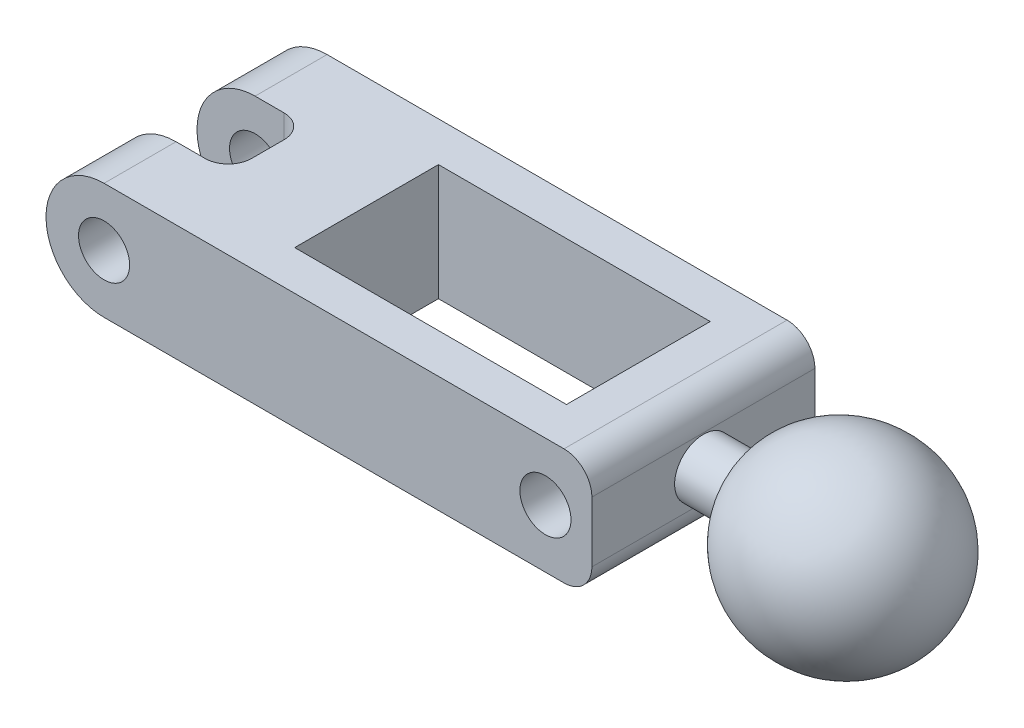
ISO-10303-21;
HEADER;
FILE_DESCRIPTION(('STEP AP214'),'2;1');
FILE_NAME('part.step','',(''),(''),'','','');
FILE_SCHEMA(('AUTOMOTIVE_DESIGN { 1 0 10303 214 1 1 1 1 }'));
ENDSEC;
DATA;
#1=APPLICATION_CONTEXT('core data for automotive mechanical design processes');
#2=APPLICATION_PROTOCOL_DEFINITION('international standard','automotive_design',2000,#1);
#3=PRODUCT_CONTEXT('',#1,'mechanical');
#4=PRODUCT('Part','Part','',(#3));
#5=PRODUCT_RELATED_PRODUCT_CATEGORY('part','',(#4));
#6=PRODUCT_DEFINITION_FORMATION('','',#4);
#7=PRODUCT_DEFINITION_CONTEXT('part definition',#1,'design');
#8=PRODUCT_DEFINITION('design','',#6,#7);
#9=PRODUCT_DEFINITION_SHAPE('','',#8);
#10=(LENGTH_UNIT() NAMED_UNIT(*) SI_UNIT(.MILLI.,.METRE.));
#11=(NAMED_UNIT(*) PLANE_ANGLE_UNIT() SI_UNIT($,.RADIAN.));
#12=(NAMED_UNIT(*) SI_UNIT($,.STERADIAN.) SOLID_ANGLE_UNIT());
#13=UNCERTAINTY_MEASURE_WITH_UNIT(LENGTH_MEASURE(1.E-05),#10,'distance_accuracy_value','');
#14=(GEOMETRIC_REPRESENTATION_CONTEXT(3) GLOBAL_UNCERTAINTY_ASSIGNED_CONTEXT((#13)) GLOBAL_UNIT_ASSIGNED_CONTEXT((#10,
#11,#12)) REPRESENTATION_CONTEXT('',''));
#15=CARTESIAN_POINT('',(0.,0.,0.));
#16=DIRECTION('',(0.,0.,1.));
#17=DIRECTION('',(1.,0.,0.));
#18=AXIS2_PLACEMENT_3D('',#15,#16,#17);
#19=CARTESIAN_POINT('',(0.,2.5,4.8));
#20=DIRECTION('',(0.,1.,0.));
#21=DIRECTION('',(-1.,0.,0.));
#22=AXIS2_PLACEMENT_3D('',#19,#20,#21);
#23=PLANE('',#22);
#24=DIRECTION('',(-1.,0.,0.));
#25=VECTOR('',#24,1.);
#26=CARTESIAN_POINT('',(0.,2.5,-3.094));
#27=LINE('',#26,#25);
#28=CARTESIAN_POINT('',(8.7,2.5,-3.094));
#29=VERTEX_POINT('',#28);
#30=CARTESIAN_POINT('',(-3.,2.5,-3.094));
#31=VERTEX_POINT('',#30);
#32=EDGE_CURVE('E240',#29,#31,#27,.T.);
#33=ORIENTED_EDGE('',*,*,#32,.F.);
#34=DIRECTION('',(0.,0.,1.));
#35=VECTOR('',#34,1.);
#36=CARTESIAN_POINT('',(8.7,2.5,4.8));
#37=LINE('',#36,#35);
#38=CARTESIAN_POINT('',(8.7,2.5,3.094));
#39=VERTEX_POINT('',#38);
#40=EDGE_CURVE('E233',#29,#39,#37,.T.);
#41=ORIENTED_EDGE('',*,*,#40,.T.);
#42=DIRECTION('',(-1.,0.,0.));
#43=VECTOR('',#42,1.);
#44=CARTESIAN_POINT('',(0.,2.5,3.094));
#45=LINE('',#44,#43);
#46=CARTESIAN_POINT('',(-3.,2.5,3.094));
#47=VERTEX_POINT('',#46);
#48=EDGE_CURVE('E225',#39,#47,#45,.T.);
#49=ORIENTED_EDGE('',*,*,#48,.T.);
#50=DIRECTION('',(0.,0.,1.));
#51=VECTOR('',#50,1.);
#52=CARTESIAN_POINT('',(-3.,2.5,4.8));
#53=LINE('',#52,#51);
#54=EDGE_CURVE('E247',#31,#47,#53,.T.);
#55=ORIENTED_EDGE('',*,*,#54,.F.);
#56=EDGE_LOOP('',(#33,#41,#49,#55));
#57=FACE_BOUND('',#56,.T.);
#58=DIRECTION('',(0.,0.,-1.));
#59=VECTOR('',#58,1.);
#60=CARTESIAN_POINT('',(-9.5,2.5,4.8));
#61=LINE('',#60,#59);
#62=CARTESIAN_POINT('',(-9.5,2.5,-1.7));
#63=VERTEX_POINT('',#62);
#64=CARTESIAN_POINT('',(-9.5,2.5,-4.8));
#65=VERTEX_POINT('',#64);
#66=EDGE_CURVE('E327',#63,#65,#61,.T.);
#67=ORIENTED_EDGE('',*,*,#66,.F.);
#68=DIRECTION('',(1.,0.,0.));
#69=VECTOR('',#68,1.);
#70=CARTESIAN_POINT('',(0.,2.5,-1.7));
#71=LINE('',#70,#69);
#72=CARTESIAN_POINT('',(-8.25,2.49999999999999,-1.7));
#73=VERTEX_POINT('',#72);
#74=EDGE_CURVE('E217',#63,#73,#71,.T.);
#75=ORIENTED_EDGE('',*,*,#74,.T.);
#76=CARTESIAN_POINT('',(-8.25,2.49999999999999,-0.7));
#77=DIRECTION('',(0.,1.,0.));
#78=DIRECTION('',(-1.,0.,0.));
#79=AXIS2_PLACEMENT_3D('',#76,#77,#78);
#80=CIRCLE('',#79,1.);
#81=CARTESIAN_POINT('',(-7.25,2.49999999999999,-0.7));
#82=VERTEX_POINT('',#81);
#83=EDGE_CURVE('E380',#73,#82,#80,.F.);
#84=ORIENTED_EDGE('',*,*,#83,.T.);
#85=DIRECTION('',(0.,0.,1.));
#86=VECTOR('',#85,1.);
#87=CARTESIAN_POINT('',(-7.25,2.49999999999999,4.8));
#88=LINE('',#87,#86);
#89=CARTESIAN_POINT('',(-7.25,2.49999999999999,0.700000000000002));
#90=VERTEX_POINT('',#89);
#91=EDGE_CURVE('E244',#82,#90,#88,.T.);
#92=ORIENTED_EDGE('',*,*,#91,.T.);
#93=CARTESIAN_POINT('',(-8.25,2.49999999999999,0.700000000000002));
#94=DIRECTION('',(0.,1.,0.));
#95=DIRECTION('',(-1.,0.,0.));
#96=AXIS2_PLACEMENT_3D('',#93,#94,#95);
#97=CIRCLE('',#96,1.);
#98=CARTESIAN_POINT('',(-8.25,2.49999999999999,1.7));
#99=VERTEX_POINT('',#98);
#100=EDGE_CURVE('E49',#90,#99,#97,.F.);
#101=ORIENTED_EDGE('',*,*,#100,.T.);
#102=DIRECTION('',(1.,0.,0.));
#103=VECTOR('',#102,1.);
#104=CARTESIAN_POINT('',(0.,2.5,1.7));
#105=LINE('',#104,#103);
#106=CARTESIAN_POINT('',(-9.5,2.5,1.7));
#107=VERTEX_POINT('',#106);
#108=EDGE_CURVE('E206',#107,#99,#105,.T.);
#109=ORIENTED_EDGE('',*,*,#108,.F.);
#110=CARTESIAN_POINT('',(-9.5,2.5,4.8));
#111=VERTEX_POINT('',#110);
#112=EDGE_CURVE('E328',#111,#107,#61,.T.);
#113=ORIENTED_EDGE('',*,*,#112,.F.);
#114=DIRECTION('',(1.,0.,0.));
#115=VECTOR('',#114,1.);
#116=CARTESIAN_POINT('',(0.,2.5,4.8));
#117=LINE('',#116,#115);
#118=CARTESIAN_POINT('',(10.3,2.5,4.8));
#119=VERTEX_POINT('',#118);
#120=EDGE_CURVE('E255',#111,#119,#117,.T.);
#121=ORIENTED_EDGE('',*,*,#120,.T.);
#122=DIRECTION('',(0.,0.,-1.));
#123=VECTOR('',#122,1.);
#124=CARTESIAN_POINT('',(10.3,2.5,4.8));
#125=LINE('',#124,#123);
#126=CARTESIAN_POINT('',(10.3,2.5,-4.8));
#127=VERTEX_POINT('',#126);
#128=EDGE_CURVE('E332',#119,#127,#125,.T.);
#129=ORIENTED_EDGE('',*,*,#128,.T.);
#130=DIRECTION('',(1.,0.,0.));
#131=VECTOR('',#130,1.);
#132=CARTESIAN_POINT('',(0.,2.5,-4.8));
#133=LINE('',#132,#131);
#134=EDGE_CURVE('E287',#65,#127,#133,.T.);
#135=ORIENTED_EDGE('',*,*,#134,.F.);
#136=EDGE_LOOP('',(#67,#75,#84,#92,#101,#109,#113,#121,#129,#135));
#137=FACE_BOUND('',#136,.T.);
#138=ADVANCED_FACE('F40',(#57,#137),#23,.T.);
#139=CARTESIAN_POINT('',(-9.5,0.,4.8));
#140=DIRECTION('',(0.,0.,-1.));
#141=DIRECTION('',(-1.,0.,0.));
#142=AXIS2_PLACEMENT_3D('',#139,#140,#141);
#143=CYLINDRICAL_SURFACE('',#142,2.5);
#144=CARTESIAN_POINT('',(-9.5,0.,-1.7));
#145=DIRECTION('',(0.,0.,1.));
#146=DIRECTION('',(1.,0.,0.));
#147=AXIS2_PLACEMENT_3D('',#144,#145,#146);
#148=CIRCLE('',#147,2.5);
#149=CARTESIAN_POINT('',(-9.5,-2.5,-1.7));
#150=VERTEX_POINT('',#149);
#151=EDGE_CURVE('E213',#63,#150,#148,.T.);
#152=ORIENTED_EDGE('',*,*,#151,.F.);
#153=ORIENTED_EDGE('',*,*,#66,.T.);
#154=CARTESIAN_POINT('',(-9.5,0.,-4.8));
#155=DIRECTION('',(0.,0.,1.));
#156=DIRECTION('',(1.,0.,0.));
#157=AXIS2_PLACEMENT_3D('',#154,#155,#156);
#158=CIRCLE('',#157,2.5);
#159=CARTESIAN_POINT('',(-9.5,-2.5,-4.8));
#160=VERTEX_POINT('',#159);
#161=EDGE_CURVE('E291',#65,#160,#158,.T.);
#162=ORIENTED_EDGE('',*,*,#161,.T.);
#163=DIRECTION('',(0.,0.,-1.));
#164=VECTOR('',#163,1.);
#165=CARTESIAN_POINT('',(-9.5,-2.5,4.8));
#166=LINE('',#165,#164);
#167=EDGE_CURVE('E322',#150,#160,#166,.T.);
#168=ORIENTED_EDGE('',*,*,#167,.F.);
#169=EDGE_LOOP('',(#152,#153,#162,#168));
#170=FACE_BOUND('',#169,.T.);
#171=ADVANCED_FACE('F427',(#170),#143,.T.);
#172=CARTESIAN_POINT('',(0.,-2.5,4.8));
#173=DIRECTION('',(0.,-1.,0.));
#174=DIRECTION('',(1.,0.,0.));
#175=AXIS2_PLACEMENT_3D('',#172,#173,#174);
#176=PLANE('',#175);
#177=DIRECTION('',(1.,0.,0.));
#178=VECTOR('',#177,1.);
#179=CARTESIAN_POINT('',(0.,-2.5,-3.094));
#180=LINE('',#179,#178);
#181=CARTESIAN_POINT('',(-3.,-2.5,-3.094));
#182=VERTEX_POINT('',#181);
#183=CARTESIAN_POINT('',(8.7,-2.5,-3.094));
#184=VERTEX_POINT('',#183);
#185=EDGE_CURVE('E237',#182,#184,#180,.T.);
#186=ORIENTED_EDGE('',*,*,#185,.F.);
#187=DIRECTION('',(0.,0.,-1.));
#188=VECTOR('',#187,1.);
#189=CARTESIAN_POINT('',(-3.,-2.5,4.8));
#190=LINE('',#189,#188);
#191=CARTESIAN_POINT('',(-3.,-2.5,3.094));
#192=VERTEX_POINT('',#191);
#193=EDGE_CURVE('E360',#192,#182,#190,.T.);
#194=ORIENTED_EDGE('',*,*,#193,.F.);
#195=DIRECTION('',(1.,0.,0.));
#196=VECTOR('',#195,1.);
#197=CARTESIAN_POINT('',(0.,-2.5,3.094));
#198=LINE('',#197,#196);
#199=CARTESIAN_POINT('',(8.7,-2.5,3.094));
#200=VERTEX_POINT('',#199);
#201=EDGE_CURVE('E221',#192,#200,#198,.T.);
#202=ORIENTED_EDGE('',*,*,#201,.T.);
#203=DIRECTION('',(0.,0.,-1.));
#204=VECTOR('',#203,1.);
#205=CARTESIAN_POINT('',(8.7,-2.5,4.8));
#206=LINE('',#205,#204);
#207=EDGE_CURVE('E229',#200,#184,#206,.T.);
#208=ORIENTED_EDGE('',*,*,#207,.T.);
#209=EDGE_LOOP('',(#186,#194,#202,#208));
#210=FACE_BOUND('',#209,.T.);
#211=DIRECTION('',(-1.,0.,0.));
#212=VECTOR('',#211,1.);
#213=CARTESIAN_POINT('',(0.,-2.5,1.7));
#214=LINE('',#213,#212);
#215=CARTESIAN_POINT('',(-8.25,-2.5,1.7));
#216=VERTEX_POINT('',#215);
#217=CARTESIAN_POINT('',(-9.5,-2.5,1.7));
#218=VERTEX_POINT('',#217);
#219=EDGE_CURVE('E198',#216,#218,#214,.T.);
#220=ORIENTED_EDGE('',*,*,#219,.F.);
#221=CARTESIAN_POINT('',(-8.25,-2.5,0.700000000000002));
#222=DIRECTION('',(0.,-1.,0.));
#223=DIRECTION('',(1.,0.,0.));
#224=AXIS2_PLACEMENT_3D('',#221,#222,#223);
#225=CIRCLE('',#224,1.);
#226=CARTESIAN_POINT('',(-7.25,-2.5,0.700000000000002));
#227=VERTEX_POINT('',#226);
#228=EDGE_CURVE('E11',#216,#227,#225,.F.);
#229=ORIENTED_EDGE('',*,*,#228,.T.);
#230=DIRECTION('',(0.,0.,-1.));
#231=VECTOR('',#230,1.);
#232=CARTESIAN_POINT('',(-7.25,-2.5,4.8));
#233=LINE('',#232,#231);
#234=CARTESIAN_POINT('',(-7.25,-2.5,-0.7));
#235=VERTEX_POINT('',#234);
#236=EDGE_CURVE('E356',#227,#235,#233,.T.);
#237=ORIENTED_EDGE('',*,*,#236,.T.);
#238=CARTESIAN_POINT('',(-8.25,-2.5,-0.7));
#239=DIRECTION('',(0.,-1.,0.));
#240=DIRECTION('',(1.,0.,0.));
#241=AXIS2_PLACEMENT_3D('',#238,#239,#240);
#242=CIRCLE('',#241,1.);
#243=CARTESIAN_POINT('',(-8.25,-2.5,-1.7));
#244=VERTEX_POINT('',#243);
#245=EDGE_CURVE('E383',#235,#244,#242,.F.);
#246=ORIENTED_EDGE('',*,*,#245,.T.);
#247=DIRECTION('',(-1.,0.,0.));
#248=VECTOR('',#247,1.);
#249=CARTESIAN_POINT('',(0.,-2.5,-1.7));
#250=LINE('',#249,#248);
#251=EDGE_CURVE('E210',#244,#150,#250,.T.);
#252=ORIENTED_EDGE('',*,*,#251,.T.);
#253=ORIENTED_EDGE('',*,*,#167,.T.);
#254=DIRECTION('',(-1.,0.,0.));
#255=VECTOR('',#254,1.);
#256=CARTESIAN_POINT('',(0.,-2.5,-4.8));
#257=LINE('',#256,#255);
#258=CARTESIAN_POINT('',(10.3,-2.5,-4.8));
#259=VERTEX_POINT('',#258);
#260=EDGE_CURVE('E295',#259,#160,#257,.T.);
#261=ORIENTED_EDGE('',*,*,#260,.F.);
#262=DIRECTION('',(0.,0.,-1.));
#263=VECTOR('',#262,1.);
#264=CARTESIAN_POINT('',(10.3,-2.5,4.8));
#265=LINE('',#264,#263);
#266=CARTESIAN_POINT('',(10.3,-2.5,4.8));
#267=VERTEX_POINT('',#266);
#268=EDGE_CURVE('E319',#267,#259,#265,.T.);
#269=ORIENTED_EDGE('',*,*,#268,.F.);
#270=DIRECTION('',(-1.,0.,0.));
#271=VECTOR('',#270,1.);
#272=CARTESIAN_POINT('',(0.,-2.5,4.8));
#273=LINE('',#272,#271);
#274=CARTESIAN_POINT('',(-9.5,-2.5,4.8));
#275=VERTEX_POINT('',#274);
#276=EDGE_CURVE('E263',#267,#275,#273,.T.);
#277=ORIENTED_EDGE('',*,*,#276,.T.);
#278=EDGE_CURVE('E323',#275,#218,#166,.T.);
#279=ORIENTED_EDGE('',*,*,#278,.T.);
#280=EDGE_LOOP('',(#220,#229,#237,#246,#252,#253,#261,#269,#277,#279));
#281=FACE_BOUND('',#280,.T.);
#282=ADVANCED_FACE('F416',(#210,#281),#176,.T.);
#283=CARTESIAN_POINT('',(-9.5,0.,4.8));
#284=DIRECTION('',(0.,0.,-1.));
#285=DIRECTION('',(-1.,0.,0.));
#286=AXIS2_PLACEMENT_3D('',#283,#284,#285);
#287=CYLINDRICAL_SURFACE('',#286,1.1);
#288=CARTESIAN_POINT('',(-9.5,0.,-4.8));
#289=DIRECTION('',(0.,0.,1.));
#290=DIRECTION('',(1.,0.,0.));
#291=AXIS2_PLACEMENT_3D('',#288,#289,#290);
#292=CIRCLE('',#291,1.1);
#293=CARTESIAN_POINT('',(-8.4,0.,-4.8));
#294=VERTEX_POINT('',#293);
#295=EDGE_CURVE('E256',#294,#294,#292,.T.);
#296=ORIENTED_EDGE('',*,*,#295,.F.);
#297=EDGE_LOOP('',(#296));
#298=FACE_BOUND('',#297,.T.);
#299=CARTESIAN_POINT('',(-9.5,0.,-1.7));
#300=DIRECTION('',(0.,0.,1.));
#301=DIRECTION('',(1.,0.,0.));
#302=AXIS2_PLACEMENT_3D('',#299,#300,#301);
#303=CIRCLE('',#302,1.1);
#304=CARTESIAN_POINT('',(-8.4,0.,-1.7));
#305=VERTEX_POINT('',#304);
#306=EDGE_CURVE('E209',#305,#305,#303,.T.);
#307=ORIENTED_EDGE('',*,*,#306,.T.);
#308=EDGE_LOOP('',(#307));
#309=FACE_BOUND('',#308,.T.);
#310=ADVANCED_FACE('F441',(#298,#309),#287,.F.);
#311=CARTESIAN_POINT('',(10.3,1.3,4.8));
#312=DIRECTION('',(0.,0.,-1.));
#313=DIRECTION('',(-1.,0.,0.));
#314=AXIS2_PLACEMENT_3D('',#311,#312,#313);
#315=CYLINDRICAL_SURFACE('',#314,1.2);
#316=CARTESIAN_POINT('',(10.3,1.3,-4.8));
#317=DIRECTION('',(0.,0.,1.));
#318=DIRECTION('',(1.,0.,0.));
#319=AXIS2_PLACEMENT_3D('',#316,#317,#318);
#320=CIRCLE('',#319,1.2);
#321=CARTESIAN_POINT('',(11.5,1.3,-4.8));
#322=VERTEX_POINT('',#321);
#323=EDGE_CURVE('E250',#127,#322,#320,.F.);
#324=ORIENTED_EDGE('',*,*,#323,.F.);
#325=ORIENTED_EDGE('',*,*,#128,.F.);
#326=CARTESIAN_POINT('',(10.3,1.3,4.8));
#327=DIRECTION('',(0.,0.,1.));
#328=DIRECTION('',(1.,0.,0.));
#329=AXIS2_PLACEMENT_3D('',#326,#327,#328);
#330=CIRCLE('',#329,1.2);
#331=CARTESIAN_POINT('',(11.5,1.3,4.8));
#332=VERTEX_POINT('',#331);
#333=EDGE_CURVE('E251',#119,#332,#330,.F.);
#334=ORIENTED_EDGE('',*,*,#333,.T.);
#335=DIRECTION('',(0.,0.,-1.));
#336=VECTOR('',#335,1.);
#337=CARTESIAN_POINT('',(11.5,1.3,4.8));
#338=LINE('',#337,#336);
#339=EDGE_CURVE('E283',#332,#322,#338,.T.);
#340=ORIENTED_EDGE('',*,*,#339,.T.);
#341=EDGE_LOOP('',(#324,#325,#334,#340));
#342=FACE_BOUND('',#341,.T.);
#343=ADVANCED_FACE('F439',(#342),#315,.T.);
#344=ORIENTED_EDGE('',*,*,#112,.T.);
#345=CARTESIAN_POINT('',(-9.5,0.,1.7));
#346=DIRECTION('',(0.,0.,1.));
#347=DIRECTION('',(1.,0.,0.));
#348=AXIS2_PLACEMENT_3D('',#345,#346,#347);
#349=CIRCLE('',#348,2.5);
#350=EDGE_CURVE('E201',#107,#218,#349,.T.);
#351=ORIENTED_EDGE('',*,*,#350,.T.);
#352=ORIENTED_EDGE('',*,*,#278,.F.);
#353=CARTESIAN_POINT('',(-9.5,0.,4.8));
#354=DIRECTION('',(0.,0.,1.));
#355=DIRECTION('',(1.,0.,0.));
#356=AXIS2_PLACEMENT_3D('',#353,#354,#355);
#357=CIRCLE('',#356,2.5);
#358=EDGE_CURVE('E260',#111,#275,#357,.T.);
#359=ORIENTED_EDGE('',*,*,#358,.F.);
#360=EDGE_LOOP('',(#344,#351,#352,#359));
#361=FACE_BOUND('',#360,.T.);
#362=ADVANCED_FACE('F436',(#361),#143,.T.);
#363=CARTESIAN_POINT('',(10.3,-1.3,4.8));
#364=DIRECTION('',(0.,0.,-1.));
#365=DIRECTION('',(-1.,0.,0.));
#366=AXIS2_PLACEMENT_3D('',#363,#364,#365);
#367=CYLINDRICAL_SURFACE('',#366,1.2);
#368=CARTESIAN_POINT('',(10.3,-1.3,-4.8));
#369=DIRECTION('',(0.,0.,1.));
#370=DIRECTION('',(1.,0.,0.));
#371=AXIS2_PLACEMENT_3D('',#368,#369,#370);
#372=CIRCLE('',#371,1.2);
#373=CARTESIAN_POINT('',(11.5,-1.29999999999999,-4.8));
#374=VERTEX_POINT('',#373);
#375=EDGE_CURVE('E299',#374,#259,#372,.F.);
#376=ORIENTED_EDGE('',*,*,#375,.F.);
#377=DIRECTION('',(0.,0.,-1.));
#378=VECTOR('',#377,1.);
#379=CARTESIAN_POINT('',(11.5,-1.29999999999999,4.8));
#380=LINE('',#379,#378);
#381=CARTESIAN_POINT('',(11.5,-1.29999999999999,4.8));
#382=VERTEX_POINT('',#381);
#383=EDGE_CURVE('E316',#382,#374,#380,.T.);
#384=ORIENTED_EDGE('',*,*,#383,.F.);
#385=CARTESIAN_POINT('',(10.3,-1.3,4.8));
#386=DIRECTION('',(0.,0.,1.));
#387=DIRECTION('',(1.,0.,0.));
#388=AXIS2_PLACEMENT_3D('',#385,#386,#387);
#389=CIRCLE('',#388,1.2);
#390=EDGE_CURVE('E267',#382,#267,#389,.F.);
#391=ORIENTED_EDGE('',*,*,#390,.T.);
#392=ORIENTED_EDGE('',*,*,#268,.T.);
#393=EDGE_LOOP('',(#376,#384,#391,#392));
#394=FACE_BOUND('',#393,.T.);
#395=ADVANCED_FACE('F471',(#394),#367,.T.);
#396=CARTESIAN_POINT('',(9.5,0.,4.8));
#397=DIRECTION('',(0.,0.,-1.));
#398=DIRECTION('',(-1.,0.,0.));
#399=AXIS2_PLACEMENT_3D('',#396,#397,#398);
#400=CYLINDRICAL_SURFACE('',#399,1.1);
#401=CARTESIAN_POINT('',(9.5,0.,-3.094));
#402=DIRECTION('',(0.,0.,-1.));
#403=DIRECTION('',(-1.,0.,0.));
#404=AXIS2_PLACEMENT_3D('',#401,#402,#403);
#405=CIRCLE('',#404,1.1);
#406=CARTESIAN_POINT('',(8.7,-0.754983443527074,-3.094));
#407=VERTEX_POINT('',#406);
#408=CARTESIAN_POINT('',(8.7,0.754983443527081,-3.094));
#409=VERTEX_POINT('',#408);
#410=EDGE_CURVE('E353',#407,#409,#405,.T.);
#411=ORIENTED_EDGE('',*,*,#410,.F.);
#412=DIRECTION('',(0.,0.,-1.));
#413=VECTOR('',#412,1.);
#414=CARTESIAN_POINT('',(8.7,-0.754983443527074,4.8));
#415=LINE('',#414,#413);
#416=CARTESIAN_POINT('',(8.7,-0.754983443527076,3.094));
#417=VERTEX_POINT('',#416);
#418=EDGE_CURVE('E345',#407,#417,#415,.F.);
#419=ORIENTED_EDGE('',*,*,#418,.T.);
#420=CARTESIAN_POINT('',(9.5,0.,3.094));
#421=DIRECTION('',(0.,0.,-1.));
#422=DIRECTION('',(-1.,0.,0.));
#423=AXIS2_PLACEMENT_3D('',#420,#421,#422);
#424=CIRCLE('',#423,1.1);
#425=CARTESIAN_POINT('',(8.7,0.754983443527083,3.094));
#426=VERTEX_POINT('',#425);
#427=EDGE_CURVE('E335',#417,#426,#424,.T.);
#428=ORIENTED_EDGE('',*,*,#427,.T.);
#429=DIRECTION('',(0.,0.,-1.));
#430=VECTOR('',#429,1.);
#431=CARTESIAN_POINT('',(8.7,0.754983443527081,4.8));
#432=LINE('',#431,#430);
#433=EDGE_CURVE('E349',#426,#409,#432,.T.);
#434=ORIENTED_EDGE('',*,*,#433,.T.);
#435=EDGE_LOOP('',(#411,#419,#428,#434));
#436=FACE_BOUND('',#435,.T.);
#437=CARTESIAN_POINT('',(9.5,0.,4.8));
#438=DIRECTION('',(0.,0.,1.));
#439=DIRECTION('',(1.,0.,0.));
#440=AXIS2_PLACEMENT_3D('',#437,#438,#439);
#441=CIRCLE('',#440,1.1);
#442=CARTESIAN_POINT('',(10.6,0.,4.8));
#443=VERTEX_POINT('',#442);
#444=EDGE_CURVE('E275',#443,#443,#441,.T.);
#445=ORIENTED_EDGE('',*,*,#444,.T.);
#446=EDGE_LOOP('',(#445));
#447=FACE_BOUND('',#446,.T.);
#448=CARTESIAN_POINT('',(9.5,0.,-4.8));
#449=DIRECTION('',(0.,0.,1.));
#450=DIRECTION('',(1.,0.,0.));
#451=AXIS2_PLACEMENT_3D('',#448,#449,#450);
#452=CIRCLE('',#451,1.1);
#453=CARTESIAN_POINT('',(10.6,0.,-4.8));
#454=VERTEX_POINT('',#453);
#455=EDGE_CURVE('E307',#454,#454,#452,.T.);
#456=ORIENTED_EDGE('',*,*,#455,.F.);
#457=EDGE_LOOP('',(#456));
#458=FACE_BOUND('',#457,.T.);
#459=ADVANCED_FACE('F400',(#436,#447,#458),#400,.F.);
#460=CARTESIAN_POINT('',(11.5,0.,4.8));
#461=DIRECTION('',(1.,0.,0.));
#462=DIRECTION('',(0.,1.,0.));
#463=AXIS2_PLACEMENT_3D('',#460,#461,#462);
#464=PLANE('',#463);
#465=CARTESIAN_POINT('',(11.5,0.,0.));
#466=DIRECTION('',(1.,0.,0.));
#467=DIRECTION('',(0.,1.,0.));
#468=AXIS2_PLACEMENT_3D('',#465,#466,#467);
#469=CIRCLE('',#468,1.24);
#470=CARTESIAN_POINT('',(11.5,1.24000000000001,0.));
#471=VERTEX_POINT('',#470);
#472=EDGE_CURVE('E363',#471,#471,#469,.T.);
#473=ORIENTED_EDGE('',*,*,#472,.F.);
#474=EDGE_LOOP('',(#473));
#475=FACE_BOUND('',#474,.T.);
#476=DIRECTION('',(0.,-1.,0.));
#477=VECTOR('',#476,1.);
#478=CARTESIAN_POINT('',(11.5,0.,-4.8));
#479=LINE('',#478,#477);
#480=EDGE_CURVE('E303',#322,#374,#479,.T.);
#481=ORIENTED_EDGE('',*,*,#480,.F.);
#482=ORIENTED_EDGE('',*,*,#339,.F.);
#483=DIRECTION('',(0.,-1.,0.));
#484=VECTOR('',#483,1.);
#485=CARTESIAN_POINT('',(11.5,0.,4.8));
#486=LINE('',#485,#484);
#487=EDGE_CURVE('E271',#332,#382,#486,.T.);
#488=ORIENTED_EDGE('',*,*,#487,.T.);
#489=ORIENTED_EDGE('',*,*,#383,.T.);
#490=EDGE_LOOP('',(#481,#482,#488,#489));
#491=FACE_BOUND('',#490,.T.);
#492=ADVANCED_FACE('F479',(#475,#491),#464,.T.);
#493=CARTESIAN_POINT('',(-9.5,0.,1.7));
#494=DIRECTION('',(0.,0.,1.));
#495=DIRECTION('',(1.,0.,0.));
#496=AXIS2_PLACEMENT_3D('',#493,#494,#495);
#497=CIRCLE('',#496,1.1);
#498=CARTESIAN_POINT('',(-8.4,0.,1.7));
#499=VERTEX_POINT('',#498);
#500=EDGE_CURVE('E202',#499,#499,#497,.T.);
#501=ORIENTED_EDGE('',*,*,#500,.F.);
#502=EDGE_LOOP('',(#501));
#503=FACE_BOUND('',#502,.T.);
#504=CARTESIAN_POINT('',(-9.5,0.,4.8));
#505=DIRECTION('',(0.,0.,1.));
#506=DIRECTION('',(1.,0.,0.));
#507=AXIS2_PLACEMENT_3D('',#504,#505,#506);
#508=CIRCLE('',#507,1.1);
#509=CARTESIAN_POINT('',(-8.4,0.,4.8));
#510=VERTEX_POINT('',#509);
#511=EDGE_CURVE('E279',#510,#510,#508,.T.);
#512=ORIENTED_EDGE('',*,*,#511,.T.);
#513=EDGE_LOOP('',(#512));
#514=FACE_BOUND('',#513,.T.);
#515=ADVANCED_FACE('F506',(#503,#514),#287,.F.);
#516=CARTESIAN_POINT('',(0.,0.,4.8));
#517=DIRECTION('',(0.,0.,1.));
#518=DIRECTION('',(1.,0.,0.));
#519=AXIS2_PLACEMENT_3D('',#516,#517,#518);
#520=PLANE('',#519);
#521=ORIENTED_EDGE('',*,*,#333,.F.);
#522=ORIENTED_EDGE('',*,*,#120,.F.);
#523=ORIENTED_EDGE('',*,*,#358,.T.);
#524=ORIENTED_EDGE('',*,*,#276,.F.);
#525=ORIENTED_EDGE('',*,*,#390,.F.);
#526=ORIENTED_EDGE('',*,*,#487,.F.);
#527=EDGE_LOOP('',(#521,#522,#523,#524,#525,#526));
#528=FACE_BOUND('',#527,.T.);
#529=ORIENTED_EDGE('',*,*,#444,.F.);
#530=EDGE_LOOP('',(#529));
#531=FACE_BOUND('',#530,.T.);
#532=ORIENTED_EDGE('',*,*,#511,.F.);
#533=EDGE_LOOP('',(#532));
#534=FACE_BOUND('',#533,.T.);
#535=ADVANCED_FACE('F476',(#528,#531,#534),#520,.T.);
#536=CARTESIAN_POINT('',(0.,0.,-4.8));
#537=DIRECTION('',(0.,0.,1.));
#538=DIRECTION('',(1.,0.,0.));
#539=AXIS2_PLACEMENT_3D('',#536,#537,#538);
#540=PLANE('',#539);
#541=ORIENTED_EDGE('',*,*,#323,.T.);
#542=ORIENTED_EDGE('',*,*,#480,.T.);
#543=ORIENTED_EDGE('',*,*,#375,.T.);
#544=ORIENTED_EDGE('',*,*,#260,.T.);
#545=ORIENTED_EDGE('',*,*,#161,.F.);
#546=ORIENTED_EDGE('',*,*,#134,.T.);
#547=EDGE_LOOP('',(#541,#542,#543,#544,#545,#546));
#548=FACE_BOUND('',#547,.T.);
#549=ORIENTED_EDGE('',*,*,#455,.T.);
#550=EDGE_LOOP('',(#549));
#551=FACE_BOUND('',#550,.T.);
#552=ORIENTED_EDGE('',*,*,#295,.T.);
#553=EDGE_LOOP('',(#552));
#554=FACE_BOUND('',#553,.T.);
#555=ADVANCED_FACE('F467',(#548,#551,#554),#540,.F.);
#556=CARTESIAN_POINT('',(-12.,-4.8,-1.7));
#557=DIRECTION('',(0.,0.,1.));
#558=DIRECTION('',(1.,0.,0.));
#559=AXIS2_PLACEMENT_3D('',#556,#557,#558);
#560=PLANE('',#559);
#561=ORIENTED_EDGE('',*,*,#306,.F.);
#562=EDGE_LOOP('',(#561));
#563=FACE_BOUND('',#562,.T.);
#564=ORIENTED_EDGE('',*,*,#251,.F.);
#565=DIRECTION('',(0.,1.,0.));
#566=VECTOR('',#565,1.);
#567=CARTESIAN_POINT('',(-8.25,2.49999999999999,-1.7));
#568=LINE('',#567,#566);
#569=EDGE_CURVE('E367',#244,#73,#568,.T.);
#570=ORIENTED_EDGE('',*,*,#569,.T.);
#571=ORIENTED_EDGE('',*,*,#74,.F.);
#572=ORIENTED_EDGE('',*,*,#151,.T.);
#573=EDGE_LOOP('',(#564,#570,#571,#572));
#574=FACE_BOUND('',#573,.T.);
#575=ADVANCED_FACE('F458',(#563,#574),#560,.T.);
#576=CARTESIAN_POINT('',(-12.,-4.8,1.7));
#577=DIRECTION('',(0.,0.,1.));
#578=DIRECTION('',(1.,0.,0.));
#579=AXIS2_PLACEMENT_3D('',#576,#577,#578);
#580=PLANE('',#579);
#581=ORIENTED_EDGE('',*,*,#108,.T.);
#582=DIRECTION('',(0.,1.,0.));
#583=VECTOR('',#582,1.);
#584=CARTESIAN_POINT('',(-8.25,-4.8,1.7));
#585=LINE('',#584,#583);
#586=EDGE_CURVE('E56',#99,#216,#585,.F.);
#587=ORIENTED_EDGE('',*,*,#586,.T.);
#588=ORIENTED_EDGE('',*,*,#219,.T.);
#589=ORIENTED_EDGE('',*,*,#350,.F.);
#590=EDGE_LOOP('',(#581,#587,#588,#589));
#591=FACE_BOUND('',#590,.T.);
#592=ORIENTED_EDGE('',*,*,#500,.T.);
#593=EDGE_LOOP('',(#592));
#594=FACE_BOUND('',#593,.T.);
#595=ADVANCED_FACE('F492',(#591,#594),#580,.F.);
#596=CARTESIAN_POINT('',(-7.25,-4.8,-1.7));
#597=DIRECTION('',(-1.,0.,0.));
#598=DIRECTION('',(0.,0.,1.));
#599=AXIS2_PLACEMENT_3D('',#596,#597,#598);
#600=PLANE('',#599);
#601=ORIENTED_EDGE('',*,*,#91,.F.);
#602=DIRECTION('',(0.,1.,0.));
#603=VECTOR('',#602,1.);
#604=CARTESIAN_POINT('',(-7.25,-2.5,-0.7));
#605=LINE('',#604,#603);
#606=EDGE_CURVE('E375',#82,#235,#605,.F.);
#607=ORIENTED_EDGE('',*,*,#606,.T.);
#608=ORIENTED_EDGE('',*,*,#236,.F.);
#609=DIRECTION('',(0.,1.,0.));
#610=VECTOR('',#609,1.);
#611=CARTESIAN_POINT('',(-7.25,-4.8,0.700000000000002));
#612=LINE('',#611,#610);
#613=EDGE_CURVE('E371',#227,#90,#612,.T.);
#614=ORIENTED_EDGE('',*,*,#613,.T.);
#615=EDGE_LOOP('',(#601,#607,#608,#614));
#616=FACE_BOUND('',#615,.T.);
#617=ADVANCED_FACE('F490',(#616),#600,.T.);
#618=CARTESIAN_POINT('',(8.7,-4.8,0.));
#619=DIRECTION('',(-1.,0.,0.));
#620=DIRECTION('',(0.,0.,1.));
#621=AXIS2_PLACEMENT_3D('',#618,#619,#620);
#622=PLANE('',#621);
#623=DIRECTION('',(0.,1.,0.));
#624=VECTOR('',#623,1.);
#625=CARTESIAN_POINT('',(8.7,-4.8,-3.094));
#626=LINE('',#625,#624);
#627=EDGE_CURVE('E185',#409,#29,#626,.T.);
#628=ORIENTED_EDGE('',*,*,#627,.F.);
#629=ORIENTED_EDGE('',*,*,#433,.F.);
#630=DIRECTION('',(0.,1.,0.));
#631=VECTOR('',#630,1.);
#632=CARTESIAN_POINT('',(8.7,-4.8,3.094));
#633=LINE('',#632,#631);
#634=EDGE_CURVE('E191',#426,#39,#633,.T.);
#635=ORIENTED_EDGE('',*,*,#634,.T.);
#636=ORIENTED_EDGE('',*,*,#40,.F.);
#637=EDGE_LOOP('',(#628,#629,#635,#636));
#638=FACE_BOUND('',#637,.T.);
#639=ADVANCED_FACE('F408',(#638),#622,.T.);
#640=CARTESIAN_POINT('',(0.,-4.8,-3.094));
#641=DIRECTION('',(0.,0.,-1.));
#642=DIRECTION('',(-1.,0.,0.));
#643=AXIS2_PLACEMENT_3D('',#640,#641,#642);
#644=PLANE('',#643);
#645=ORIENTED_EDGE('',*,*,#32,.T.);
#646=DIRECTION('',(0.,1.,0.));
#647=VECTOR('',#646,1.);
#648=CARTESIAN_POINT('',(-3.,-4.8,-3.094));
#649=LINE('',#648,#647);
#650=EDGE_CURVE('E177',#182,#31,#649,.T.);
#651=ORIENTED_EDGE('',*,*,#650,.F.);
#652=ORIENTED_EDGE('',*,*,#185,.T.);
#653=EDGE_CURVE('E189',#184,#407,#626,.T.);
#654=ORIENTED_EDGE('',*,*,#653,.T.);
#655=ORIENTED_EDGE('',*,*,#410,.T.);
#656=ORIENTED_EDGE('',*,*,#627,.T.);
#657=EDGE_LOOP('',(#645,#651,#652,#654,#655,#656));
#658=FACE_BOUND('',#657,.T.);
#659=ADVANCED_FACE('F405',(#658),#644,.F.);
#660=EDGE_CURVE('E190',#200,#417,#633,.T.);
#661=ORIENTED_EDGE('',*,*,#660,.T.);
#662=ORIENTED_EDGE('',*,*,#418,.F.);
#663=ORIENTED_EDGE('',*,*,#653,.F.);
#664=ORIENTED_EDGE('',*,*,#207,.F.);
#665=EDGE_LOOP('',(#661,#662,#663,#664));
#666=FACE_BOUND('',#665,.T.);
#667=ADVANCED_FACE('F394',(#666),#622,.T.);
#668=CARTESIAN_POINT('',(0.,-4.8,3.094));
#669=DIRECTION('',(0.,0.,-1.));
#670=DIRECTION('',(-1.,0.,0.));
#671=AXIS2_PLACEMENT_3D('',#668,#669,#670);
#672=PLANE('',#671);
#673=ORIENTED_EDGE('',*,*,#634,.F.);
#674=ORIENTED_EDGE('',*,*,#427,.F.);
#675=ORIENTED_EDGE('',*,*,#660,.F.);
#676=ORIENTED_EDGE('',*,*,#201,.F.);
#677=DIRECTION('',(0.,1.,0.));
#678=VECTOR('',#677,1.);
#679=CARTESIAN_POINT('',(-3.,-4.8,3.094));
#680=LINE('',#679,#678);
#681=EDGE_CURVE('E180',#192,#47,#680,.T.);
#682=ORIENTED_EDGE('',*,*,#681,.T.);
#683=ORIENTED_EDGE('',*,*,#48,.F.);
#684=EDGE_LOOP('',(#673,#674,#675,#676,#682,#683));
#685=FACE_BOUND('',#684,.T.);
#686=ADVANCED_FACE('F418',(#685),#672,.T.);
#687=CARTESIAN_POINT('',(-3.,-4.8,0.));
#688=DIRECTION('',(-1.,0.,0.));
#689=DIRECTION('',(0.,0.,1.));
#690=AXIS2_PLACEMENT_3D('',#687,#688,#689);
#691=PLANE('',#690);
#692=ORIENTED_EDGE('',*,*,#54,.T.);
#693=ORIENTED_EDGE('',*,*,#681,.F.);
#694=ORIENTED_EDGE('',*,*,#193,.T.);
#695=ORIENTED_EDGE('',*,*,#650,.T.);
#696=EDGE_LOOP('',(#692,#693,#694,#695));
#697=FACE_BOUND('',#696,.T.);
#698=ADVANCED_FACE('F170',(#697),#691,.F.);
#699=CARTESIAN_POINT('',(17.4999850896652,-0.0283753036899565,0.));
#700=DIRECTION('',(0.,0.,1.));
#701=DIRECTION('',(0.99997713765527,0.00676196471252551,0.));
#702=AXIS2_PLACEMENT_3D('',#699,#700,#701);
#703=ELLIPSE('',#702,4.19631052457218,4.);
#704=TRIMMED_CURVE('',#703,(PARAMETER_VALUE(3.12740491536895)),
(PARAMETER_VALUE(6.28318530717959)),.T.,.PARAMETER.);
#705=CARTESIAN_POINT('',(11.5,0.,0.));
#706=DIRECTION('',(-1.,0.,0.));
#707=AXIS1_PLACEMENT('',#705,#706);
#708=SURFACE_OF_REVOLUTION('',#704,#707);
#709=CARTESIAN_POINT('',(21.6961996767395,0.,0.));
#710=VERTEX_POINT('',#709);
#711=VERTEX_LOOP('',#710);
#712=FACE_BOUND('',#711,.T.);
#713=CARTESIAN_POINT('',(13.5,0.,0.));
#714=DIRECTION('',(-1.,0.,0.));
#715=DIRECTION('',(0.,-1.,0.));
#716=AXIS2_PLACEMENT_3D('',#713,#714,#715);
#717=CIRCLE('',#716,1.24);
#718=CARTESIAN_POINT('',(13.5,-1.24,0.));
#719=VERTEX_POINT('',#718);
#720=EDGE_CURVE('E174',#719,#719,#717,.T.);
#721=ORIENTED_EDGE('',*,*,#720,.F.);
#722=EDGE_LOOP('',(#721));
#723=FACE_BOUND('',#722,.T.);
#724=ADVANCED_FACE('F166',(#712,#723),#708,.F.);
#725=CARTESIAN_POINT('',(11.5,0.,0.));
#726=DIRECTION('',(-1.,0.,0.));
#727=DIRECTION('',(0.,-1.,0.));
#728=AXIS2_PLACEMENT_3D('',#725,#726,#727);
#729=CYLINDRICAL_SURFACE('',#728,1.24);
#730=ORIENTED_EDGE('',*,*,#720,.T.);
#731=EDGE_LOOP('',(#730));
#732=FACE_BOUND('',#731,.T.);
#733=ORIENTED_EDGE('',*,*,#472,.T.);
#734=EDGE_LOOP('',(#733));
#735=FACE_BOUND('',#734,.T.);
#736=ADVANCED_FACE('F169',(#732,#735),#729,.T.);
#737=CARTESIAN_POINT('',(-8.25,-4.8,-0.7));
#738=DIRECTION('',(0.,-1.,0.));
#739=DIRECTION('',(0.,0.,-1.));
#740=AXIS2_PLACEMENT_3D('',#737,#738,#739);
#741=CYLINDRICAL_SURFACE('',#740,1.);
#742=ORIENTED_EDGE('',*,*,#245,.F.);
#743=ORIENTED_EDGE('',*,*,#606,.F.);
#744=ORIENTED_EDGE('',*,*,#83,.F.);
#745=ORIENTED_EDGE('',*,*,#569,.F.);
#746=EDGE_LOOP('',(#742,#743,#744,#745));
#747=FACE_BOUND('',#746,.T.);
#748=ADVANCED_FACE('F443',(#747),#741,.F.);
#749=CARTESIAN_POINT('',(-8.25,-4.8,0.700000000000002));
#750=DIRECTION('',(0.,1.,0.));
#751=DIRECTION('',(0.,0.,1.));
#752=AXIS2_PLACEMENT_3D('',#749,#750,#751);
#753=CYLINDRICAL_SURFACE('',#752,1.);
#754=ORIENTED_EDGE('',*,*,#228,.F.);
#755=ORIENTED_EDGE('',*,*,#586,.F.);
#756=ORIENTED_EDGE('',*,*,#100,.F.);
#757=ORIENTED_EDGE('',*,*,#613,.F.);
#758=EDGE_LOOP('',(#754,#755,#756,#757));
#759=FACE_BOUND('',#758,.T.);
#760=ADVANCED_FACE('F42',(#759),#753,.F.);
#761=CLOSED_SHELL('',(#138,#171,#282,#310,#343,#362,#395,#459,#492,#515,#535,#555,#575,#595,
#617,#639,#659,#667,#686,#698,#724,#736,#748,#760));
#762=MANIFOLD_SOLID_BREP('B2',#761);
#763=ADVANCED_BREP_SHAPE_REPRESENTATION('',(#18,#762),#14);
#764=SHAPE_DEFINITION_REPRESENTATION(#9,#763);
ENDSEC;
END-ISO-10303-21;
